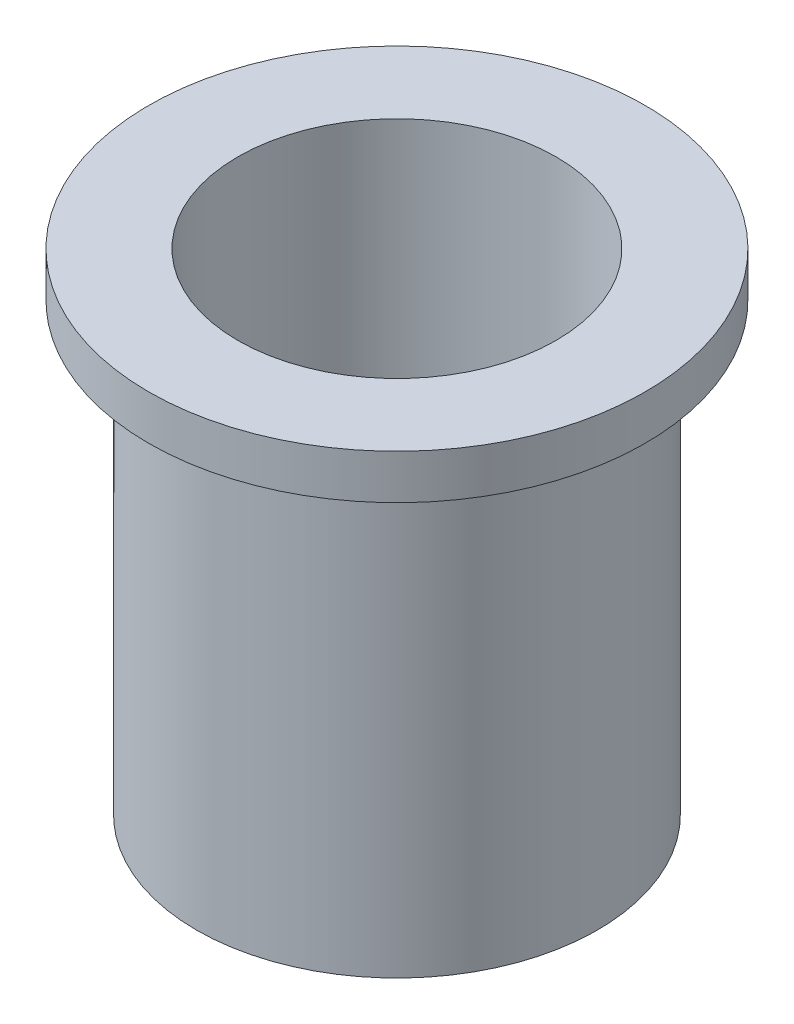
ISO-10303-21;
HEADER;
FILE_DESCRIPTION(('STEP AP214'),'2;1');
FILE_NAME('part.step','',(''),(''),'','','');
FILE_SCHEMA(('AUTOMOTIVE_DESIGN { 1 0 10303 214 1 1 1 1 }'));
ENDSEC;
DATA;
#1=APPLICATION_CONTEXT('core data for automotive mechanical design processes');
#2=APPLICATION_PROTOCOL_DEFINITION('international standard','automotive_design',2000,#1);
#3=PRODUCT_CONTEXT('',#1,'mechanical');
#4=PRODUCT('Part','Part','',(#3));
#5=PRODUCT_RELATED_PRODUCT_CATEGORY('part','',(#4));
#6=PRODUCT_DEFINITION_FORMATION('','',#4);
#7=PRODUCT_DEFINITION_CONTEXT('part definition',#1,'design');
#8=PRODUCT_DEFINITION('design','',#6,#7);
#9=PRODUCT_DEFINITION_SHAPE('','',#8);
#10=(LENGTH_UNIT() NAMED_UNIT(*) SI_UNIT(.MILLI.,.METRE.));
#11=(NAMED_UNIT(*) PLANE_ANGLE_UNIT() SI_UNIT($,.RADIAN.));
#12=(NAMED_UNIT(*) SI_UNIT($,.STERADIAN.) SOLID_ANGLE_UNIT());
#13=UNCERTAINTY_MEASURE_WITH_UNIT(LENGTH_MEASURE(1.E-05),#10,'distance_accuracy_value','');
#14=(GEOMETRIC_REPRESENTATION_CONTEXT(3) GLOBAL_UNCERTAINTY_ASSIGNED_CONTEXT((#13)) GLOBAL_UNIT_ASSIGNED_CONTEXT((#10,
#11,#12)) REPRESENTATION_CONTEXT('',''));
#15=CARTESIAN_POINT('',(0.,0.,0.));
#16=DIRECTION('',(0.,0.,1.));
#17=DIRECTION('',(1.,0.,0.));
#18=AXIS2_PLACEMENT_3D('',#15,#16,#17);
#19=CARTESIAN_POINT('',(9.,-11.,0.));
#20=DIRECTION('',(0.,1.,0.));
#21=DIRECTION('',(0.,0.,1.));
#22=AXIS2_PLACEMENT_3D('',#19,#20,#21);
#23=PLANE('',#22);
#24=CARTESIAN_POINT('',(0.,-11.,0.));
#25=DIRECTION('',(0.,1.,0.));
#26=DIRECTION('',(0.,0.,1.));
#27=AXIS2_PLACEMENT_3D('',#24,#25,#26);
#28=CIRCLE('',#27,9.);
#29=CARTESIAN_POINT('',(0.,-11.,9.));
#30=VERTEX_POINT('',#29);
#31=EDGE_CURVE('E68',#30,#30,#28,.T.);
#32=ORIENTED_EDGE('',*,*,#31,.F.);
#33=EDGE_LOOP('',(#32));
#34=FACE_BOUND('',#33,.T.);
#35=CARTESIAN_POINT('',(0.,-11.,0.));
#36=DIRECTION('',(0.,1.,0.));
#37=DIRECTION('',(0.,0.,1.));
#38=AXIS2_PLACEMENT_3D('',#35,#36,#37);
#39=CIRCLE('',#38,7.14375);
#40=CARTESIAN_POINT('',(0.,-11.,7.14375));
#41=VERTEX_POINT('',#40);
#42=EDGE_CURVE('E10',#41,#41,#39,.T.);
#43=ORIENTED_EDGE('',*,*,#42,.T.);
#44=EDGE_LOOP('',(#43));
#45=FACE_BOUND('',#44,.T.);
#46=ADVANCED_FACE('F41',(#34,#45),#23,.F.);
#47=CARTESIAN_POINT('',(0.,24.995105125612,0.));
#48=DIRECTION('',(0.,1.,0.));
#49=DIRECTION('',(0.,0.,1.));
#50=AXIS2_PLACEMENT_3D('',#47,#48,#49);
#51=CYLINDRICAL_SURFACE('',#50,7.14375);
#52=ORIENTED_EDGE('',*,*,#42,.F.);
#53=EDGE_LOOP('',(#52));
#54=FACE_BOUND('',#53,.T.);
#55=CARTESIAN_POINT('',(0.,11.,0.));
#56=DIRECTION('',(0.,1.,0.));
#57=DIRECTION('',(0.,0.,1.));
#58=AXIS2_PLACEMENT_3D('',#55,#56,#57);
#59=CIRCLE('',#58,7.14375);
#60=CARTESIAN_POINT('',(0.,11.,7.14375));
#61=VERTEX_POINT('',#60);
#62=EDGE_CURVE('E48',#61,#61,#59,.T.);
#63=ORIENTED_EDGE('',*,*,#62,.T.);
#64=EDGE_LOOP('',(#63));
#65=FACE_BOUND('',#64,.T.);
#66=ADVANCED_FACE('F76',(#54,#65),#51,.F.);
#67=CARTESIAN_POINT('',(7.14375,11.,0.));
#68=DIRECTION('',(0.,-1.,0.));
#69=DIRECTION('',(0.,0.,-1.));
#70=AXIS2_PLACEMENT_3D('',#67,#68,#69);
#71=PLANE('',#70);
#72=ORIENTED_EDGE('',*,*,#62,.F.);
#73=EDGE_LOOP('',(#72));
#74=FACE_BOUND('',#73,.T.);
#75=CARTESIAN_POINT('',(0.,11.,0.));
#76=DIRECTION('',(0.,1.,0.));
#77=DIRECTION('',(0.,0.,1.));
#78=AXIS2_PLACEMENT_3D('',#75,#76,#77);
#79=CIRCLE('',#78,11.14375);
#80=CARTESIAN_POINT('',(0.,11.,11.14375));
#81=VERTEX_POINT('',#80);
#82=EDGE_CURVE('E53',#81,#81,#79,.T.);
#83=ORIENTED_EDGE('',*,*,#82,.T.);
#84=EDGE_LOOP('',(#83));
#85=FACE_BOUND('',#84,.T.);
#86=ADVANCED_FACE('F80',(#74,#85),#71,.F.);
#87=CARTESIAN_POINT('',(0.,24.995105125612,0.));
#88=DIRECTION('',(0.,1.,0.));
#89=DIRECTION('',(0.,0.,1.));
#90=AXIS2_PLACEMENT_3D('',#87,#88,#89);
#91=CYLINDRICAL_SURFACE('',#90,11.14375);
#92=ORIENTED_EDGE('',*,*,#82,.F.);
#93=EDGE_LOOP('',(#92));
#94=FACE_BOUND('',#93,.T.);
#95=CARTESIAN_POINT('',(0.,9.00000000000001,0.));
#96=DIRECTION('',(0.,1.,0.));
#97=DIRECTION('',(0.,0.,1.));
#98=AXIS2_PLACEMENT_3D('',#95,#96,#97);
#99=CIRCLE('',#98,11.14375);
#100=CARTESIAN_POINT('',(0.,9.00000000000001,11.14375));
#101=VERTEX_POINT('',#100);
#102=EDGE_CURVE('E58',#101,#101,#99,.T.);
#103=ORIENTED_EDGE('',*,*,#102,.T.);
#104=EDGE_LOOP('',(#103));
#105=FACE_BOUND('',#104,.T.);
#106=ADVANCED_FACE('F85',(#94,#105),#91,.T.);
#107=CARTESIAN_POINT('',(11.14375,9.,0.));
#108=DIRECTION('',(0.,1.,0.));
#109=DIRECTION('',(0.,0.,1.));
#110=AXIS2_PLACEMENT_3D('',#107,#108,#109);
#111=PLANE('',#110);
#112=ORIENTED_EDGE('',*,*,#102,.F.);
#113=EDGE_LOOP('',(#112));
#114=FACE_BOUND('',#113,.T.);
#115=CARTESIAN_POINT('',(0.,9.00000000000001,0.));
#116=DIRECTION('',(0.,1.,0.));
#117=DIRECTION('',(0.,0.,1.));
#118=AXIS2_PLACEMENT_3D('',#115,#116,#117);
#119=CIRCLE('',#118,9.);
#120=CARTESIAN_POINT('',(0.,9.00000000000001,9.));
#121=VERTEX_POINT('',#120);
#122=EDGE_CURVE('E64',#121,#121,#119,.T.);
#123=ORIENTED_EDGE('',*,*,#122,.T.);
#124=EDGE_LOOP('',(#123));
#125=FACE_BOUND('',#124,.T.);
#126=ADVANCED_FACE('F91',(#114,#125),#111,.F.);
#127=CARTESIAN_POINT('',(0.,24.995105125612,0.));
#128=DIRECTION('',(0.,1.,0.));
#129=DIRECTION('',(0.,0.,1.));
#130=AXIS2_PLACEMENT_3D('',#127,#128,#129);
#131=CYLINDRICAL_SURFACE('',#130,9.);
#132=ORIENTED_EDGE('',*,*,#122,.F.);
#133=EDGE_LOOP('',(#132));
#134=FACE_BOUND('',#133,.T.);
#135=ORIENTED_EDGE('',*,*,#31,.T.);
#136=EDGE_LOOP('',(#135));
#137=FACE_BOUND('',#136,.T.);
#138=ADVANCED_FACE('F73',(#134,#137),#131,.T.);
#139=CLOSED_SHELL('',(#46,#66,#86,#106,#126,#138));
#140=MANIFOLD_SOLID_BREP('B2',#139);
#141=ADVANCED_BREP_SHAPE_REPRESENTATION('',(#18,#140),#14);
#142=SHAPE_DEFINITION_REPRESENTATION(#9,#141);
ENDSEC;
END-ISO-10303-21;
